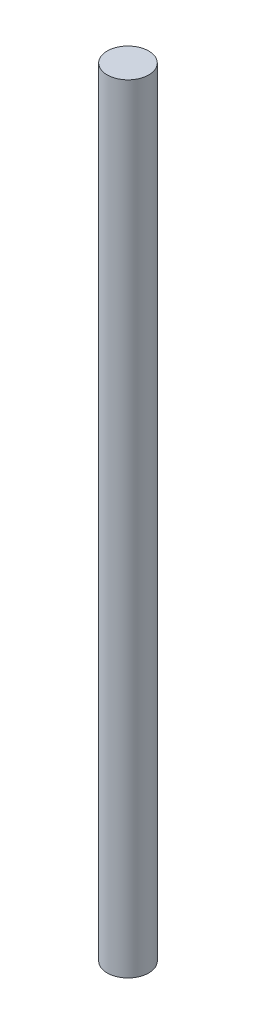
ISO-10303-21;
HEADER;
FILE_DESCRIPTION(('STEP AP214'),'2;1');
FILE_NAME('part.step','',(''),(''),'','','');
FILE_SCHEMA(('AUTOMOTIVE_DESIGN { 1 0 10303 214 1 1 1 1 }'));
ENDSEC;
DATA;
#1=APPLICATION_CONTEXT('core data for automotive mechanical design processes');
#2=APPLICATION_PROTOCOL_DEFINITION('international standard','automotive_design',2000,#1);
#3=PRODUCT_CONTEXT('',#1,'mechanical');
#4=PRODUCT('Part','Part','',(#3));
#5=PRODUCT_RELATED_PRODUCT_CATEGORY('part','',(#4));
#6=PRODUCT_DEFINITION_FORMATION('','',#4);
#7=PRODUCT_DEFINITION_CONTEXT('part definition',#1,'design');
#8=PRODUCT_DEFINITION('design','',#6,#7);
#9=PRODUCT_DEFINITION_SHAPE('','',#8);
#10=(LENGTH_UNIT() NAMED_UNIT(*) SI_UNIT(.MILLI.,.METRE.));
#11=(NAMED_UNIT(*) PLANE_ANGLE_UNIT() SI_UNIT($,.RADIAN.));
#12=(NAMED_UNIT(*) SI_UNIT($,.STERADIAN.) SOLID_ANGLE_UNIT());
#13=UNCERTAINTY_MEASURE_WITH_UNIT(LENGTH_MEASURE(1.E-05),#10,'distance_accuracy_value','');
#14=(GEOMETRIC_REPRESENTATION_CONTEXT(3) GLOBAL_UNCERTAINTY_ASSIGNED_CONTEXT((#13)) GLOBAL_UNIT_ASSIGNED_CONTEXT((#10,
#11,#12)) REPRESENTATION_CONTEXT('',''));
#15=CARTESIAN_POINT('',(0.,0.,0.));
#16=DIRECTION('',(0.,0.,1.));
#17=DIRECTION('',(1.,0.,0.));
#18=AXIS2_PLACEMENT_3D('',#15,#16,#17);
#19=CARTESIAN_POINT('',(0.,150.,0.));
#20=DIRECTION('',(0.,-1.,0.));
#21=DIRECTION('',(0.,0.,-1.));
#22=AXIS2_PLACEMENT_3D('',#19,#20,#21);
#23=CYLINDRICAL_SURFACE('',#22,4.);
#24=CARTESIAN_POINT('',(0.,150.,0.));
#25=DIRECTION('',(0.,1.,0.));
#26=DIRECTION('',(0.,0.,1.));
#27=AXIS2_PLACEMENT_3D('',#24,#25,#26);
#28=CIRCLE('',#27,4.);
#29=CARTESIAN_POINT('',(0.,150.,4.));
#30=VERTEX_POINT('',#29);
#31=EDGE_CURVE('E10',#30,#30,#28,.T.);
#32=ORIENTED_EDGE('',*,*,#31,.F.);
#33=EDGE_LOOP('',(#32));
#34=FACE_BOUND('',#33,.T.);
#35=CARTESIAN_POINT('',(0.,0.,0.));
#36=DIRECTION('',(0.,1.,0.));
#37=DIRECTION('',(0.,0.,1.));
#38=AXIS2_PLACEMENT_3D('',#35,#36,#37);
#39=CIRCLE('',#38,4.);
#40=CARTESIAN_POINT('',(0.,0.,4.));
#41=VERTEX_POINT('',#40);
#42=EDGE_CURVE('E36',#41,#41,#39,.T.);
#43=ORIENTED_EDGE('',*,*,#42,.T.);
#44=EDGE_LOOP('',(#43));
#45=FACE_BOUND('',#44,.T.);
#46=ADVANCED_FACE('F33',(#34,#45),#23,.T.);
#47=CARTESIAN_POINT('',(0.,150.,0.));
#48=DIRECTION('',(0.,1.,0.));
#49=DIRECTION('',(0.,0.,1.));
#50=AXIS2_PLACEMENT_3D('',#47,#48,#49);
#51=PLANE('',#50);
#52=ORIENTED_EDGE('',*,*,#31,.T.);
#53=EDGE_LOOP('',(#52));
#54=FACE_BOUND('',#53,.T.);
#55=ADVANCED_FACE('F48',(#54),#51,.T.);
#56=CARTESIAN_POINT('',(0.,0.,0.));
#57=DIRECTION('',(0.,1.,0.));
#58=DIRECTION('',(0.,0.,1.));
#59=AXIS2_PLACEMENT_3D('',#56,#57,#58);
#60=PLANE('',#59);
#61=ORIENTED_EDGE('',*,*,#42,.F.);
#62=EDGE_LOOP('',(#61));
#63=FACE_BOUND('',#62,.T.);
#64=ADVANCED_FACE('F46',(#63),#60,.F.);
#65=CLOSED_SHELL('',(#46,#55,#64));
#66=MANIFOLD_SOLID_BREP('B2',#65);
#67=ADVANCED_BREP_SHAPE_REPRESENTATION('',(#18,#66),#14);
#68=SHAPE_DEFINITION_REPRESENTATION(#9,#67);
ENDSEC;
END-ISO-10303-21;
